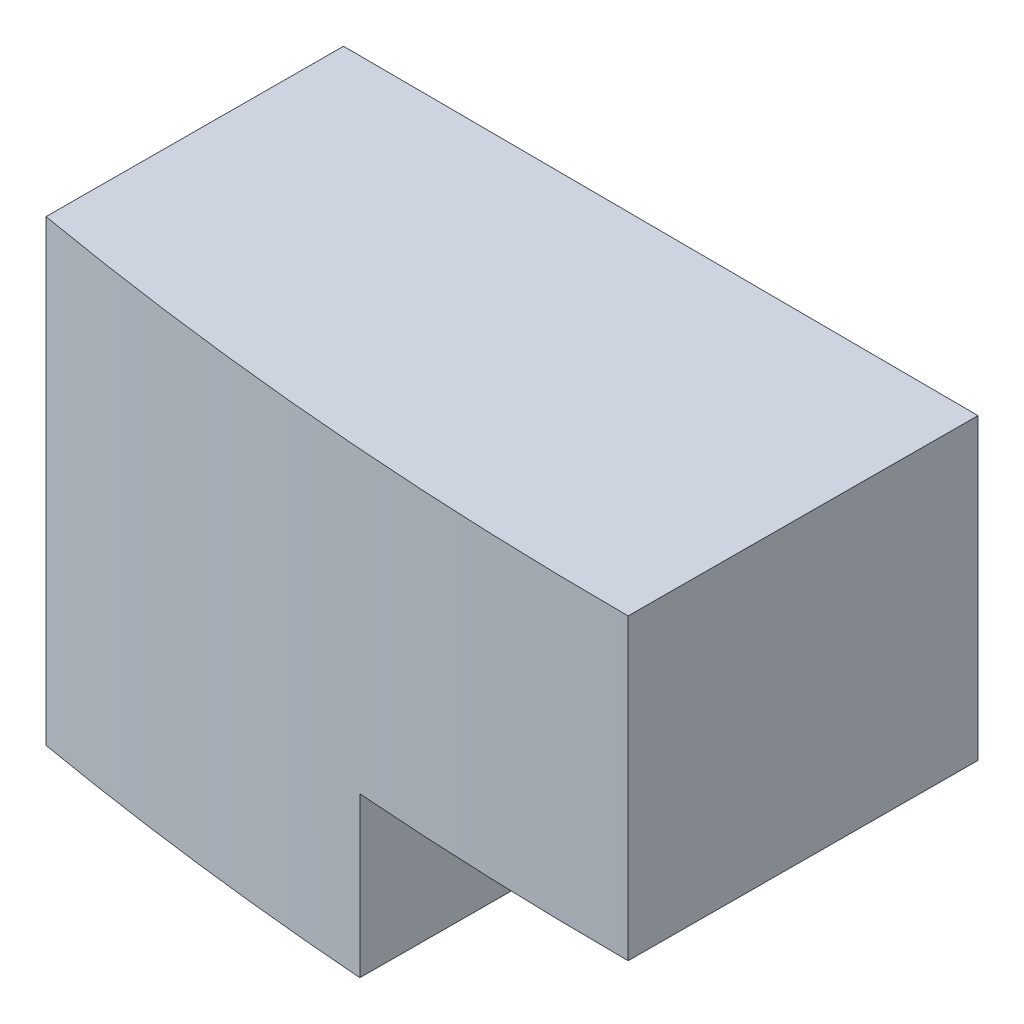
ISO-10303-21;
HEADER;
FILE_DESCRIPTION(('STEP AP214'),'2;1');
FILE_NAME('part.step','',(''),(''),'','','');
FILE_SCHEMA(('AUTOMOTIVE_DESIGN { 1 0 10303 214 1 1 1 1 }'));
ENDSEC;
DATA;
#1=APPLICATION_CONTEXT('core data for automotive mechanical design processes');
#2=APPLICATION_PROTOCOL_DEFINITION('international standard','automotive_design',2000,#1);
#3=PRODUCT_CONTEXT('',#1,'mechanical');
#4=PRODUCT('Part','Part','',(#3));
#5=PRODUCT_RELATED_PRODUCT_CATEGORY('part','',(#4));
#6=PRODUCT_DEFINITION_FORMATION('','',#4);
#7=PRODUCT_DEFINITION_CONTEXT('part definition',#1,'design');
#8=PRODUCT_DEFINITION('design','',#6,#7);
#9=PRODUCT_DEFINITION_SHAPE('','',#8);
#10=(LENGTH_UNIT() NAMED_UNIT(*) SI_UNIT(.MILLI.,.METRE.));
#11=(NAMED_UNIT(*) PLANE_ANGLE_UNIT() SI_UNIT($,.RADIAN.));
#12=(NAMED_UNIT(*) SI_UNIT($,.STERADIAN.) SOLID_ANGLE_UNIT());
#13=UNCERTAINTY_MEASURE_WITH_UNIT(LENGTH_MEASURE(1.E-05),#10,'distance_accuracy_value','');
#14=(GEOMETRIC_REPRESENTATION_CONTEXT(3) GLOBAL_UNCERTAINTY_ASSIGNED_CONTEXT((#13)) GLOBAL_UNIT_ASSIGNED_CONTEXT((#10,
#11,#12)) REPRESENTATION_CONTEXT('',''));
#15=CARTESIAN_POINT('',(0.,0.,0.));
#16=DIRECTION('',(0.,0.,1.));
#17=DIRECTION('',(1.,0.,0.));
#18=AXIS2_PLACEMENT_3D('',#15,#16,#17);
#19=CARTESIAN_POINT('',(0.,9.2,0.));
#20=DIRECTION('',(0.,-1.,0.));
#21=DIRECTION('',(0.,0.,-1.));
#22=AXIS2_PLACEMENT_3D('',#19,#20,#21);
#23=CYLINDRICAL_SURFACE('',#22,75.);
#24=DIRECTION('',(0.,-1.,0.));
#25=VECTOR('',#24,1.);
#26=CARTESIAN_POINT('',(-5.59917242306802,9.2,74.7907030865251));
#27=LINE('',#26,#25);
#28=CARTESIAN_POINT('',(-5.59917242306802,0.,74.7907030865251));
#29=VERTEX_POINT('',#28);
#30=CARTESIAN_POINT('',(-5.59917242306802,3.2,74.7907030865251));
#31=VERTEX_POINT('',#30);
#32=EDGE_CURVE('E48',#29,#31,#27,.F.);
#33=ORIENTED_EDGE('',*,*,#32,.T.);
#34=CARTESIAN_POINT('',(0.,3.2,0.));
#35=DIRECTION('',(0.,1.,0.));
#36=DIRECTION('',(0.,0.,1.));
#37=AXIS2_PLACEMENT_3D('',#34,#35,#36);
#38=CIRCLE('',#37,75.);
#39=CARTESIAN_POINT('',(0.,3.2,75.));
#40=VERTEX_POINT('',#39);
#41=EDGE_CURVE('E114',#31,#40,#38,.T.);
#42=ORIENTED_EDGE('',*,*,#41,.T.);
#43=DIRECTION('',(0.,-1.,0.));
#44=VECTOR('',#43,1.);
#45=CARTESIAN_POINT('',(0.,9.2,75.));
#46=LINE('',#45,#44);
#47=CARTESIAN_POINT('',(0.,9.2,75.));
#48=VERTEX_POINT('',#47);
#49=EDGE_CURVE('E41',#48,#40,#46,.T.);
#50=ORIENTED_EDGE('',*,*,#49,.F.);
#51=CARTESIAN_POINT('',(0.,9.2,0.));
#52=DIRECTION('',(0.,1.,0.));
#53=DIRECTION('',(0.,0.,1.));
#54=AXIS2_PLACEMENT_3D('',#51,#52,#53);
#55=CIRCLE('',#54,75.);
#56=CARTESIAN_POINT('',(-12.7955064414011,9.2,73.9004398830485));
#57=VERTEX_POINT('',#56);
#58=EDGE_CURVE('E112',#57,#48,#55,.T.);
#59=ORIENTED_EDGE('',*,*,#58,.F.);
#60=DIRECTION('',(0.,-1.,0.));
#61=VECTOR('',#60,1.);
#62=CARTESIAN_POINT('',(-12.7955064414011,9.2,73.9004398830485));
#63=LINE('',#62,#61);
#64=CARTESIAN_POINT('',(-12.7955064414011,0.,73.9004398830485));
#65=VERTEX_POINT('',#64);
#66=EDGE_CURVE('E118',#57,#65,#63,.T.);
#67=ORIENTED_EDGE('',*,*,#66,.T.);
#68=CARTESIAN_POINT('',(0.,0.,0.));
#69=DIRECTION('',(0.,1.,0.));
#70=DIRECTION('',(0.,0.,1.));
#71=AXIS2_PLACEMENT_3D('',#68,#69,#70);
#72=CIRCLE('',#71,75.);
#73=EDGE_CURVE('E110',#65,#29,#72,.T.);
#74=ORIENTED_EDGE('',*,*,#73,.T.);
#75=EDGE_LOOP('',(#33,#42,#50,#59,#67,#74));
#76=FACE_BOUND('',#75,.T.);
#77=ADVANCED_FACE('F34',(#76),#23,.T.);
#78=CARTESIAN_POINT('',(0.,9.2,75.));
#79=DIRECTION('',(-0.999991227031138,0.,-0.00418877795539671));
#80=DIRECTION('',(-0.00418877795539671,0.,0.999991227031138));
#81=AXIS2_PLACEMENT_3D('',#78,#79,#80);
#82=PLANE('',#81);
#83=ORIENTED_EDGE('',*,*,#49,.T.);
#84=DIRECTION('',(0.00418877795539674,0.,-0.999991227031138));
#85=VECTOR('',#84,1.);
#86=CARTESIAN_POINT('',(-0.000224508174360559,3.2,75.0535970651004));
#87=LINE('',#86,#85);
#88=CARTESIAN_POINT('',(0.0293217029261729,3.2,68.));
#89=VERTEX_POINT('',#88);
#90=EDGE_CURVE('E126',#40,#89,#87,.T.);
#91=ORIENTED_EDGE('',*,*,#90,.T.);
#92=DIRECTION('',(0.,-1.,0.));
#93=VECTOR('',#92,1.);
#94=CARTESIAN_POINT('',(0.029321702926173,9.2,68.));
#95=LINE('',#94,#93);
#96=CARTESIAN_POINT('',(0.029321702926173,9.2,68.));
#97=VERTEX_POINT('',#96);
#98=EDGE_CURVE('E122',#97,#89,#95,.T.);
#99=ORIENTED_EDGE('',*,*,#98,.F.);
#100=DIRECTION('',(0.00418877795539671,0.,-0.999991227031138));
#101=VECTOR('',#100,1.);
#102=CARTESIAN_POINT('',(0.,9.2,75.));
#103=LINE('',#102,#101);
#104=EDGE_CURVE('E79',#48,#97,#103,.T.);
#105=ORIENTED_EDGE('',*,*,#104,.F.);
#106=EDGE_LOOP('',(#83,#91,#99,#105));
#107=FACE_BOUND('',#106,.T.);
#108=ADVANCED_FACE('F125',(#107),#82,.F.);
#109=CARTESIAN_POINT('',(0.029321702926173,9.2,68.));
#110=DIRECTION('',(-0.00418877795539674,0.,0.999991227031138));
#111=DIRECTION('',(0.999991227031138,0.,0.00418877795539674));
#112=AXIS2_PLACEMENT_3D('',#109,#110,#111);
#113=PLANE('',#112);
#114=ORIENTED_EDGE('',*,*,#98,.T.);
#115=DIRECTION('',(0.999991227031138,0.,0.00418877795539674));
#116=VECTOR('',#115,1.);
#117=CARTESIAN_POINT('',(0.0293217029261729,3.2,68.));
#118=LINE('',#117,#116);
#119=CARTESIAN_POINT('',(-5.5706291684482,3.2,67.9765428434498));
#120=VERTEX_POINT('',#119);
#121=EDGE_CURVE('E107',#120,#89,#118,.T.);
#122=ORIENTED_EDGE('',*,*,#121,.F.);
#123=DIRECTION('',(0.,1.,0.));
#124=VECTOR('',#123,1.);
#125=CARTESIAN_POINT('',(-5.5706291684482,3.2,67.9765428434498));
#126=LINE('',#125,#124);
#127=CARTESIAN_POINT('',(-5.5706291684482,0.,67.9765428434498));
#128=VERTEX_POINT('',#127);
#129=EDGE_CURVE('E96',#128,#120,#126,.T.);
#130=ORIENTED_EDGE('',*,*,#129,.F.);
#131=DIRECTION('',(-0.999991227031138,0.,-0.00418877795539674));
#132=VECTOR('',#131,1.);
#133=CARTESIAN_POINT('',(0.029321702926173,0.,68.));
#134=LINE('',#133,#132);
#135=CARTESIAN_POINT('',(-12.7705660030724,0.,67.9463836421709));
#136=VERTEX_POINT('',#135);
#137=EDGE_CURVE('E106',#128,#136,#134,.T.);
#138=ORIENTED_EDGE('',*,*,#137,.T.);
#139=DIRECTION('',(0.,-1.,0.));
#140=VECTOR('',#139,1.);
#141=CARTESIAN_POINT('',(-12.7705660030724,9.2,67.9463836421709));
#142=LINE('',#141,#140);
#143=CARTESIAN_POINT('',(-12.7705660030724,9.2,67.9463836421709));
#144=VERTEX_POINT('',#143);
#145=EDGE_CURVE('E120',#144,#136,#142,.T.);
#146=ORIENTED_EDGE('',*,*,#145,.F.);
#147=DIRECTION('',(-0.999991227031138,0.,-0.00418877795539674));
#148=VECTOR('',#147,1.);
#149=CARTESIAN_POINT('',(0.029321702926173,9.2,68.));
#150=LINE('',#149,#148);
#151=EDGE_CURVE('E137',#97,#144,#150,.T.);
#152=ORIENTED_EDGE('',*,*,#151,.F.);
#153=EDGE_LOOP('',(#114,#122,#130,#138,#146,#152));
#154=FACE_BOUND('',#153,.T.);
#155=ADVANCED_FACE('F104',(#154),#113,.F.);
#156=CARTESIAN_POINT('',(-12.7705660030724,9.2,67.9463836421709));
#157=DIRECTION('',(0.999991227031138,0.,0.00418877795539592));
#158=DIRECTION('',(0.00418877795539592,0.,-0.999991227031138));
#159=AXIS2_PLACEMENT_3D('',#156,#157,#158);
#160=PLANE('',#159);
#161=DIRECTION('',(-0.00418877795539592,0.,0.999991227031138));
#162=VECTOR('',#161,1.);
#163=CARTESIAN_POINT('',(-12.7705660030724,0.,67.9463836421709));
#164=LINE('',#163,#162);
#165=EDGE_CURVE('E71',#136,#65,#164,.T.);
#166=ORIENTED_EDGE('',*,*,#165,.T.);
#167=ORIENTED_EDGE('',*,*,#66,.F.);
#168=DIRECTION('',(-0.00418877795539592,0.,0.999991227031138));
#169=VECTOR('',#168,1.);
#170=CARTESIAN_POINT('',(-12.7705660030724,9.2,67.9463836421709));
#171=LINE('',#170,#169);
#172=EDGE_CURVE('E56',#144,#57,#171,.T.);
#173=ORIENTED_EDGE('',*,*,#172,.F.);
#174=ORIENTED_EDGE('',*,*,#145,.T.);
#175=EDGE_LOOP('',(#166,#167,#173,#174));
#176=FACE_BOUND('',#175,.T.);
#177=ADVANCED_FACE('F140',(#176),#160,.F.);
#178=CARTESIAN_POINT('',(0.,9.2,0.));
#179=DIRECTION('',(0.,1.,0.));
#180=DIRECTION('',(0.,0.,1.));
#181=AXIS2_PLACEMENT_3D('',#178,#179,#180);
#182=PLANE('',#181);
#183=ORIENTED_EDGE('',*,*,#58,.T.);
#184=ORIENTED_EDGE('',*,*,#104,.T.);
#185=ORIENTED_EDGE('',*,*,#151,.T.);
#186=ORIENTED_EDGE('',*,*,#172,.T.);
#187=EDGE_LOOP('',(#183,#184,#185,#186));
#188=FACE_BOUND('',#187,.T.);
#189=ADVANCED_FACE('F139',(#188),#182,.T.);
#190=CARTESIAN_POINT('',(0.,0.,0.));
#191=DIRECTION('',(0.,1.,0.));
#192=DIRECTION('',(0.,0.,1.));
#193=AXIS2_PLACEMENT_3D('',#190,#191,#192);
#194=PLANE('',#193);
#195=ORIENTED_EDGE('',*,*,#137,.F.);
#196=DIRECTION('',(-0.00418877795539674,0.,0.999991227031138));
#197=VECTOR('',#196,1.);
#198=CARTESIAN_POINT('',(-5.285795280821,0.,-0.0221412169932504));
#199=LINE('',#198,#197);
#200=EDGE_CURVE('E11',#128,#29,#199,.T.);
#201=ORIENTED_EDGE('',*,*,#200,.T.);
#202=ORIENTED_EDGE('',*,*,#73,.F.);
#203=ORIENTED_EDGE('',*,*,#165,.F.);
#204=EDGE_LOOP('',(#195,#201,#202,#203));
#205=FACE_BOUND('',#204,.T.);
#206=ADVANCED_FACE('F109',(#205),#194,.F.);
#207=CARTESIAN_POINT('',(-0.000224508174360559,3.2,75.0535970651004));
#208=DIRECTION('',(0.,1.,0.));
#209=DIRECTION('',(0.,0.,1.));
#210=AXIS2_PLACEMENT_3D('',#207,#208,#209);
#211=PLANE('',#210);
#212=DIRECTION('',(0.00418877795539674,0.,-0.999991227031138));
#213=VECTOR('',#212,1.);
#214=CARTESIAN_POINT('',(-5.60017537954873,3.2,75.0301399085502));
#215=LINE('',#214,#213);
#216=EDGE_CURVE('E190',#31,#120,#215,.T.);
#217=ORIENTED_EDGE('',*,*,#216,.T.);
#218=ORIENTED_EDGE('',*,*,#121,.T.);
#219=ORIENTED_EDGE('',*,*,#90,.F.);
#220=ORIENTED_EDGE('',*,*,#41,.F.);
#221=EDGE_LOOP('',(#217,#218,#219,#220));
#222=FACE_BOUND('',#221,.T.);
#223=ADVANCED_FACE('F170',(#222),#211,.F.);
#224=CARTESIAN_POINT('',(-5.60017537954873,3.2,75.0301399085502));
#225=DIRECTION('',(-0.999991227031138,0.,-0.00418877795539674));
#226=DIRECTION('',(-0.00418877795539674,0.,0.999991227031138));
#227=AXIS2_PLACEMENT_3D('',#224,#225,#226);
#228=PLANE('',#227);
#229=ORIENTED_EDGE('',*,*,#200,.F.);
#230=ORIENTED_EDGE('',*,*,#129,.T.);
#231=ORIENTED_EDGE('',*,*,#216,.F.);
#232=ORIENTED_EDGE('',*,*,#32,.F.);
#233=EDGE_LOOP('',(#229,#230,#231,#232));
#234=FACE_BOUND('',#233,.T.);
#235=ADVANCED_FACE('F95',(#234),#228,.F.);
#236=CLOSED_SHELL('',(#77,#108,#155,#177,#189,#206,#223,#235));
#237=MANIFOLD_SOLID_BREP('B2',#236);
#238=ADVANCED_BREP_SHAPE_REPRESENTATION('',(#18,#237),#14);
#239=SHAPE_DEFINITION_REPRESENTATION(#9,#238);
ENDSEC;
END-ISO-10303-21;
